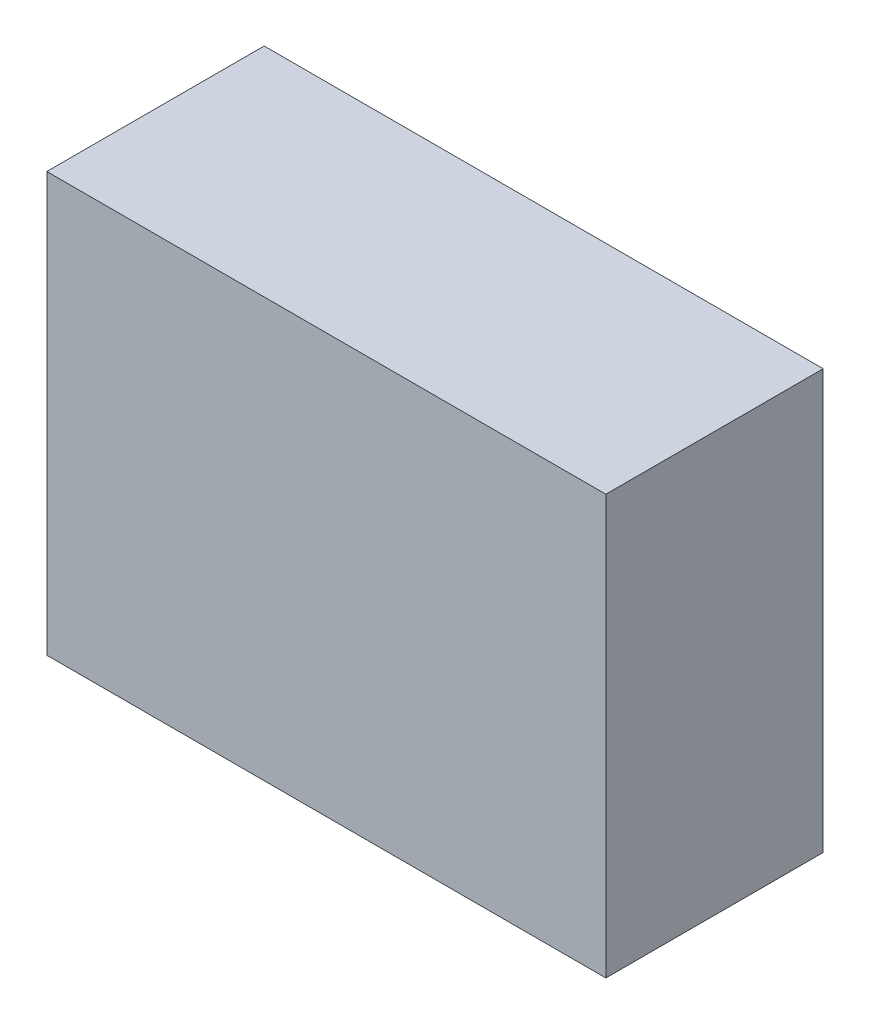
ISO-10303-21;
HEADER;
FILE_DESCRIPTION(('STEP AP214'),'2;1');
FILE_NAME('part.step','',(''),(''),'','','');
FILE_SCHEMA(('AUTOMOTIVE_DESIGN { 1 0 10303 214 1 1 1 1 }'));
ENDSEC;
DATA;
#1=APPLICATION_CONTEXT('core data for automotive mechanical design processes');
#2=APPLICATION_PROTOCOL_DEFINITION('international standard','automotive_design',2000,#1);
#3=PRODUCT_CONTEXT('',#1,'mechanical');
#4=PRODUCT('Part','Part','',(#3));
#5=PRODUCT_RELATED_PRODUCT_CATEGORY('part','',(#4));
#6=PRODUCT_DEFINITION_FORMATION('','',#4);
#7=PRODUCT_DEFINITION_CONTEXT('part definition',#1,'design');
#8=PRODUCT_DEFINITION('design','',#6,#7);
#9=PRODUCT_DEFINITION_SHAPE('','',#8);
#10=(LENGTH_UNIT() NAMED_UNIT(*) SI_UNIT(.MILLI.,.METRE.));
#11=(NAMED_UNIT(*) PLANE_ANGLE_UNIT() SI_UNIT($,.RADIAN.));
#12=(NAMED_UNIT(*) SI_UNIT($,.STERADIAN.) SOLID_ANGLE_UNIT());
#13=UNCERTAINTY_MEASURE_WITH_UNIT(LENGTH_MEASURE(1.E-05),#10,'distance_accuracy_value','');
#14=(GEOMETRIC_REPRESENTATION_CONTEXT(3) GLOBAL_UNCERTAINTY_ASSIGNED_CONTEXT((#13)) GLOBAL_UNIT_ASSIGNED_CONTEXT((#10,
#11,#12)) REPRESENTATION_CONTEXT('',''));
#15=CARTESIAN_POINT('',(0.,0.,0.));
#16=DIRECTION('',(0.,0.,1.));
#17=DIRECTION('',(1.,0.,0.));
#18=AXIS2_PLACEMENT_3D('',#15,#16,#17);
#19=CARTESIAN_POINT('',(23.15,-17.35,18.));
#20=DIRECTION('',(-1.,0.,0.));
#21=DIRECTION('',(0.,0.,1.));
#22=AXIS2_PLACEMENT_3D('',#19,#20,#21);
#23=PLANE('',#22);
#24=DIRECTION('',(0.,1.,0.));
#25=VECTOR('',#24,1.);
#26=CARTESIAN_POINT('',(23.15,-17.35,0.));
#27=LINE('',#26,#25);
#28=CARTESIAN_POINT('',(23.15,-17.35,0.));
#29=VERTEX_POINT('',#28);
#30=CARTESIAN_POINT('',(23.15,17.35,0.));
#31=VERTEX_POINT('',#30);
#32=EDGE_CURVE('E102',#29,#31,#27,.T.);
#33=ORIENTED_EDGE('',*,*,#32,.T.);
#34=DIRECTION('',(0.,0.,-1.));
#35=VECTOR('',#34,1.);
#36=CARTESIAN_POINT('',(23.15,17.35,18.));
#37=LINE('',#36,#35);
#38=CARTESIAN_POINT('',(23.15,17.35,18.));
#39=VERTEX_POINT('',#38);
#40=EDGE_CURVE('E11',#39,#31,#37,.T.);
#41=ORIENTED_EDGE('',*,*,#40,.F.);
#42=DIRECTION('',(0.,1.,0.));
#43=VECTOR('',#42,1.);
#44=CARTESIAN_POINT('',(23.15,-17.35,18.));
#45=LINE('',#44,#43);
#46=CARTESIAN_POINT('',(23.15,-17.35,18.));
#47=VERTEX_POINT('',#46);
#48=EDGE_CURVE('E90',#47,#39,#45,.T.);
#49=ORIENTED_EDGE('',*,*,#48,.F.);
#50=DIRECTION('',(0.,0.,-1.));
#51=VECTOR('',#50,1.);
#52=CARTESIAN_POINT('',(23.15,-17.35,18.));
#53=LINE('',#52,#51);
#54=EDGE_CURVE('E98',#47,#29,#53,.T.);
#55=ORIENTED_EDGE('',*,*,#54,.T.);
#56=EDGE_LOOP('',(#33,#41,#49,#55));
#57=FACE_BOUND('',#56,.T.);
#58=ADVANCED_FACE('F39',(#57),#23,.F.);
#59=CARTESIAN_POINT('',(-23.15,17.35,18.));
#60=DIRECTION('',(0.,-1.,0.));
#61=DIRECTION('',(0.,0.,-1.));
#62=AXIS2_PLACEMENT_3D('',#59,#60,#61);
#63=PLANE('',#62);
#64=DIRECTION('',(-1.,0.,0.));
#65=VECTOR('',#64,1.);
#66=CARTESIAN_POINT('',(-23.15,17.35,0.));
#67=LINE('',#66,#65);
#68=CARTESIAN_POINT('',(-23.15,17.35,0.));
#69=VERTEX_POINT('',#68);
#70=EDGE_CURVE('E94',#31,#69,#67,.T.);
#71=ORIENTED_EDGE('',*,*,#70,.T.);
#72=DIRECTION('',(0.,0.,-1.));
#73=VECTOR('',#72,1.);
#74=CARTESIAN_POINT('',(-23.15,17.35,18.));
#75=LINE('',#74,#73);
#76=CARTESIAN_POINT('',(-23.15,17.35,18.));
#77=VERTEX_POINT('',#76);
#78=EDGE_CURVE('E47',#77,#69,#75,.T.);
#79=ORIENTED_EDGE('',*,*,#78,.F.);
#80=DIRECTION('',(-1.,0.,0.));
#81=VECTOR('',#80,1.);
#82=CARTESIAN_POINT('',(-23.15,17.35,18.));
#83=LINE('',#82,#81);
#84=EDGE_CURVE('E85',#39,#77,#83,.T.);
#85=ORIENTED_EDGE('',*,*,#84,.F.);
#86=ORIENTED_EDGE('',*,*,#40,.T.);
#87=EDGE_LOOP('',(#71,#79,#85,#86));
#88=FACE_BOUND('',#87,.T.);
#89=ADVANCED_FACE('F93',(#88),#63,.F.);
#90=CARTESIAN_POINT('',(-23.15,-17.35,18.));
#91=DIRECTION('',(1.,0.,0.));
#92=DIRECTION('',(0.,0.,-1.));
#93=AXIS2_PLACEMENT_3D('',#90,#91,#92);
#94=PLANE('',#93);
#95=DIRECTION('',(0.,-1.,0.));
#96=VECTOR('',#95,1.);
#97=CARTESIAN_POINT('',(-23.15,-17.35,0.));
#98=LINE('',#97,#96);
#99=CARTESIAN_POINT('',(-23.15,-17.35,0.));
#100=VERTEX_POINT('',#99);
#101=EDGE_CURVE('E72',#69,#100,#98,.T.);
#102=ORIENTED_EDGE('',*,*,#101,.T.);
#103=DIRECTION('',(0.,0.,-1.));
#104=VECTOR('',#103,1.);
#105=CARTESIAN_POINT('',(-23.15,-17.35,18.));
#106=LINE('',#105,#104);
#107=CARTESIAN_POINT('',(-23.15,-17.35,18.));
#108=VERTEX_POINT('',#107);
#109=EDGE_CURVE('E95',#108,#100,#106,.T.);
#110=ORIENTED_EDGE('',*,*,#109,.F.);
#111=DIRECTION('',(0.,-1.,0.));
#112=VECTOR('',#111,1.);
#113=CARTESIAN_POINT('',(-23.15,-17.35,18.));
#114=LINE('',#113,#112);
#115=EDGE_CURVE('E88',#77,#108,#114,.T.);
#116=ORIENTED_EDGE('',*,*,#115,.F.);
#117=ORIENTED_EDGE('',*,*,#78,.T.);
#118=EDGE_LOOP('',(#102,#110,#116,#117));
#119=FACE_BOUND('',#118,.T.);
#120=ADVANCED_FACE('F96',(#119),#94,.F.);
#121=CARTESIAN_POINT('',(-23.15,-17.35,18.));
#122=DIRECTION('',(0.,1.,0.));
#123=DIRECTION('',(0.,0.,1.));
#124=AXIS2_PLACEMENT_3D('',#121,#122,#123);
#125=PLANE('',#124);
#126=DIRECTION('',(1.,0.,0.));
#127=VECTOR('',#126,1.);
#128=CARTESIAN_POINT('',(-23.15,-17.35,0.));
#129=LINE('',#128,#127);
#130=EDGE_CURVE('E78',#100,#29,#129,.T.);
#131=ORIENTED_EDGE('',*,*,#130,.T.);
#132=ORIENTED_EDGE('',*,*,#54,.F.);
#133=DIRECTION('',(1.,0.,0.));
#134=VECTOR('',#133,1.);
#135=CARTESIAN_POINT('',(-23.15,-17.35,18.));
#136=LINE('',#135,#134);
#137=EDGE_CURVE('E55',#108,#47,#136,.T.);
#138=ORIENTED_EDGE('',*,*,#137,.F.);
#139=ORIENTED_EDGE('',*,*,#109,.T.);
#140=EDGE_LOOP('',(#131,#132,#138,#139));
#141=FACE_BOUND('',#140,.T.);
#142=ADVANCED_FACE('F109',(#141),#125,.F.);
#143=CARTESIAN_POINT('',(0.,0.,18.));
#144=DIRECTION('',(0.,0.,-1.));
#145=DIRECTION('',(-1.,0.,0.));
#146=AXIS2_PLACEMENT_3D('',#143,#144,#145);
#147=PLANE('',#146);
#148=ORIENTED_EDGE('',*,*,#48,.T.);
#149=ORIENTED_EDGE('',*,*,#84,.T.);
#150=ORIENTED_EDGE('',*,*,#115,.T.);
#151=ORIENTED_EDGE('',*,*,#137,.T.);
#152=EDGE_LOOP('',(#148,#149,#150,#151));
#153=FACE_BOUND('',#152,.T.);
#154=ADVANCED_FACE('F86',(#153),#147,.F.);
#155=CARTESIAN_POINT('',(0.,0.,0.));
#156=DIRECTION('',(0.,0.,-1.));
#157=DIRECTION('',(-1.,0.,0.));
#158=AXIS2_PLACEMENT_3D('',#155,#156,#157);
#159=PLANE('',#158);
#160=ORIENTED_EDGE('',*,*,#32,.F.);
#161=ORIENTED_EDGE('',*,*,#130,.F.);
#162=ORIENTED_EDGE('',*,*,#101,.F.);
#163=ORIENTED_EDGE('',*,*,#70,.F.);
#164=EDGE_LOOP('',(#160,#161,#162,#163));
#165=FACE_BOUND('',#164,.T.);
#166=ADVANCED_FACE('F112',(#165),#159,.T.);
#167=CLOSED_SHELL('',(#58,#89,#120,#142,#154,#166));
#168=MANIFOLD_SOLID_BREP('B2',#167);
#169=ADVANCED_BREP_SHAPE_REPRESENTATION('',(#18,#168),#14);
#170=SHAPE_DEFINITION_REPRESENTATION(#9,#169);
ENDSEC;
END-ISO-10303-21;
